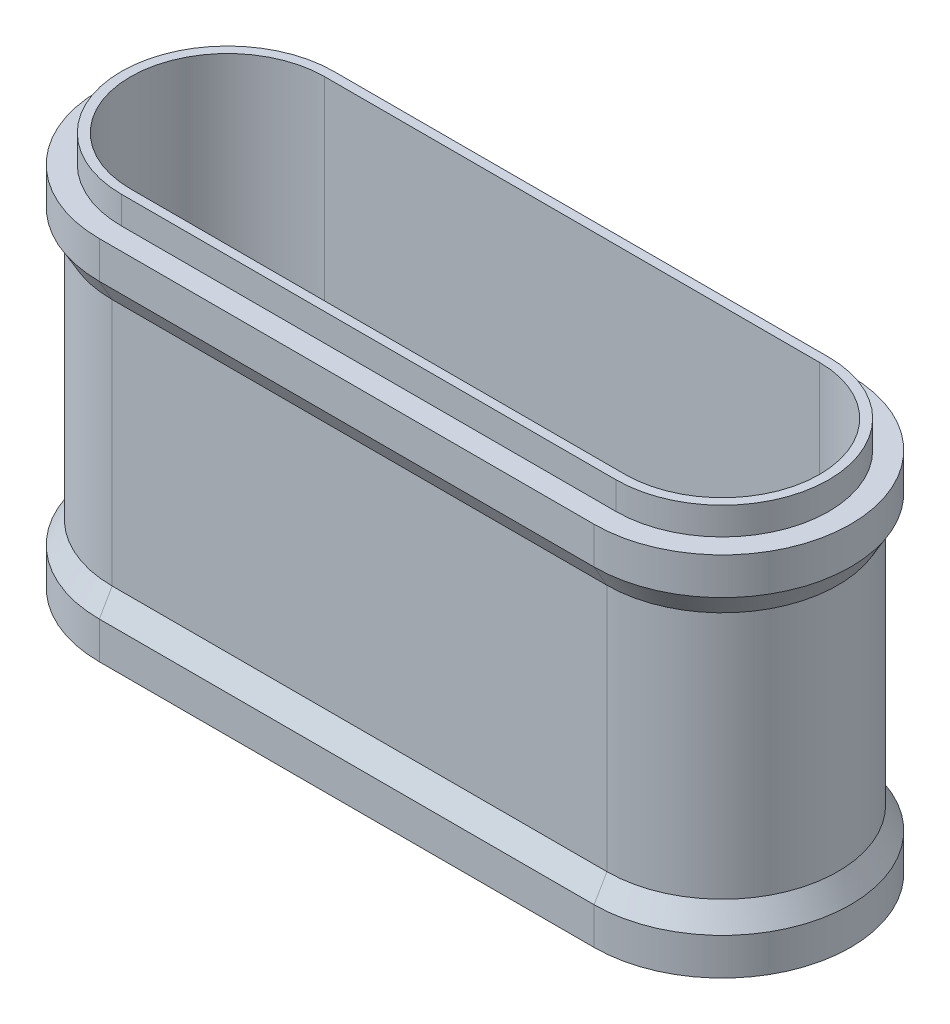
ISO-10303-21;
HEADER;
FILE_DESCRIPTION(('STEP AP214'),'2;1');
FILE_NAME('part.step','',(''),(''),'','','');
FILE_SCHEMA(('AUTOMOTIVE_DESIGN { 1 0 10303 214 1 1 1 1 }'));
ENDSEC;
DATA;
#1=APPLICATION_CONTEXT('core data for automotive mechanical design processes');
#2=APPLICATION_PROTOCOL_DEFINITION('international standard','automotive_design',2000,#1);
#3=PRODUCT_CONTEXT('',#1,'mechanical');
#4=PRODUCT('Part','Part','',(#3));
#5=PRODUCT_RELATED_PRODUCT_CATEGORY('part','',(#4));
#6=PRODUCT_DEFINITION_FORMATION('','',#4);
#7=PRODUCT_DEFINITION_CONTEXT('part definition',#1,'design');
#8=PRODUCT_DEFINITION('design','',#6,#7);
#9=PRODUCT_DEFINITION_SHAPE('','',#8);
#10=(LENGTH_UNIT() NAMED_UNIT(*) SI_UNIT(.MILLI.,.METRE.));
#11=(NAMED_UNIT(*) PLANE_ANGLE_UNIT() SI_UNIT($,.RADIAN.));
#12=(NAMED_UNIT(*) SI_UNIT($,.STERADIAN.) SOLID_ANGLE_UNIT());
#13=UNCERTAINTY_MEASURE_WITH_UNIT(LENGTH_MEASURE(1.E-05),#10,'distance_accuracy_value','');
#14=(GEOMETRIC_REPRESENTATION_CONTEXT(3) GLOBAL_UNCERTAINTY_ASSIGNED_CONTEXT((#13)) GLOBAL_UNIT_ASSIGNED_CONTEXT((#10,
#11,#12)) REPRESENTATION_CONTEXT('',''));
#15=CARTESIAN_POINT('',(0.,0.,0.));
#16=DIRECTION('',(0.,0.,1.));
#17=DIRECTION('',(1.,0.,0.));
#18=AXIS2_PLACEMENT_3D('',#15,#16,#17);
#19=CARTESIAN_POINT('',(-13.5,10.,0.));
#20=DIRECTION('',(0.,1.,0.));
#21=DIRECTION('',(0.,0.,1.));
#22=AXIS2_PLACEMENT_3D('',#19,#20,#21);
#23=PLANE('',#22);
#24=CARTESIAN_POINT('',(13.5,10.,0.));
#25=DIRECTION('',(0.,1.,0.));
#26=DIRECTION('',(0.,0.,1.));
#27=AXIS2_PLACEMENT_3D('',#24,#25,#26);
#28=CIRCLE('',#27,7.);
#29=CARTESIAN_POINT('',(13.5,10.,6.99999999999999));
#30=VERTEX_POINT('',#29);
#31=CARTESIAN_POINT('',(13.5,10.,-7.00000000000001));
#32=VERTEX_POINT('',#31);
#33=EDGE_CURVE('E293',#30,#32,#28,.T.);
#34=ORIENTED_EDGE('',*,*,#33,.T.);
#35=DIRECTION('',(-1.,0.,0.));
#36=VECTOR('',#35,1.);
#37=CARTESIAN_POINT('',(13.5,10.,-7.00000000000001));
#38=LINE('',#37,#36);
#39=CARTESIAN_POINT('',(-13.5,10.,-7.));
#40=VERTEX_POINT('',#39);
#41=EDGE_CURVE('E307',#32,#40,#38,.T.);
#42=ORIENTED_EDGE('',*,*,#41,.T.);
#43=CARTESIAN_POINT('',(-13.5,10.,0.));
#44=DIRECTION('',(0.,1.,0.));
#45=DIRECTION('',(0.,0.,1.));
#46=AXIS2_PLACEMENT_3D('',#43,#44,#45);
#47=CIRCLE('',#46,7.);
#48=CARTESIAN_POINT('',(-13.5,10.,7.));
#49=VERTEX_POINT('',#48);
#50=EDGE_CURVE('E311',#40,#49,#47,.T.);
#51=ORIENTED_EDGE('',*,*,#50,.T.);
#52=DIRECTION('',(1.,0.,0.));
#53=VECTOR('',#52,1.);
#54=CARTESIAN_POINT('',(13.5,10.,6.99999999999999));
#55=LINE('',#54,#53);
#56=EDGE_CURVE('E315',#49,#30,#55,.T.);
#57=ORIENTED_EDGE('',*,*,#56,.T.);
#58=EDGE_LOOP('',(#34,#42,#51,#57));
#59=FACE_BOUND('',#58,.T.);
#60=DIRECTION('',(1.,0.,0.));
#61=VECTOR('',#60,1.);
#62=CARTESIAN_POINT('',(-13.5,10.,5.8));
#63=LINE('',#62,#61);
#64=CARTESIAN_POINT('',(-13.5,10.,5.8));
#65=VERTEX_POINT('',#64);
#66=CARTESIAN_POINT('',(13.5,10.,5.8));
#67=VERTEX_POINT('',#66);
#68=EDGE_CURVE('E253',#65,#67,#63,.T.);
#69=ORIENTED_EDGE('',*,*,#68,.F.);
#70=CARTESIAN_POINT('',(-13.5,10.,0.));
#71=DIRECTION('',(0.,1.,0.));
#72=DIRECTION('',(0.,0.,1.));
#73=AXIS2_PLACEMENT_3D('',#70,#71,#72);
#74=CIRCLE('',#73,5.8);
#75=CARTESIAN_POINT('',(-13.5,10.,-5.8));
#76=VERTEX_POINT('',#75);
#77=EDGE_CURVE('E234',#76,#65,#74,.T.);
#78=ORIENTED_EDGE('',*,*,#77,.F.);
#79=DIRECTION('',(-1.,0.,0.));
#80=VECTOR('',#79,1.);
#81=CARTESIAN_POINT('',(13.5,10.,-5.8));
#82=LINE('',#81,#80);
#83=CARTESIAN_POINT('',(13.5,10.,-5.8));
#84=VERTEX_POINT('',#83);
#85=EDGE_CURVE('E240',#84,#76,#82,.T.);
#86=ORIENTED_EDGE('',*,*,#85,.F.);
#87=CARTESIAN_POINT('',(13.5,10.,0.));
#88=DIRECTION('',(0.,1.,0.));
#89=DIRECTION('',(0.,0.,1.));
#90=AXIS2_PLACEMENT_3D('',#87,#88,#89);
#91=CIRCLE('',#90,5.8);
#92=EDGE_CURVE('E256',#67,#84,#91,.T.);
#93=ORIENTED_EDGE('',*,*,#92,.F.);
#94=EDGE_LOOP('',(#69,#78,#86,#93));
#95=FACE_BOUND('',#94,.T.);
#96=ADVANCED_FACE('F55',(#59,#95),#23,.T.);
#97=CARTESIAN_POINT('',(-13.5,-10.,0.));
#98=DIRECTION('',(0.,1.,0.));
#99=DIRECTION('',(0.,0.,1.));
#100=AXIS2_PLACEMENT_3D('',#97,#98,#99);
#101=CYLINDRICAL_SURFACE('',#100,6.3);
#102=DIRECTION('',(0.,1.,0.));
#103=VECTOR('',#102,1.);
#104=CARTESIAN_POINT('',(-13.5,-10.,-6.3));
#105=LINE('',#104,#103);
#106=CARTESIAN_POINT('',(-13.5,-6.76794919243109,-6.3));
#107=VERTEX_POINT('',#106);
#108=CARTESIAN_POINT('',(-13.5,6.76794919243109,-6.3));
#109=VERTEX_POINT('',#108);
#110=EDGE_CURVE('E350',#107,#109,#105,.T.);
#111=ORIENTED_EDGE('',*,*,#110,.F.);
#112=CARTESIAN_POINT('',(-13.5,-6.76794919243109,0.));
#113=DIRECTION('',(0.,-1.,0.));
#114=DIRECTION('',(0.,0.,-1.));
#115=AXIS2_PLACEMENT_3D('',#112,#113,#114);
#116=CIRCLE('',#115,6.3);
#117=CARTESIAN_POINT('',(-13.5,-6.76794919243109,6.3));
#118=VERTEX_POINT('',#117);
#119=EDGE_CURVE('E387',#107,#118,#116,.F.);
#120=ORIENTED_EDGE('',*,*,#119,.T.);
#121=DIRECTION('',(0.,1.,0.));
#122=VECTOR('',#121,1.);
#123=CARTESIAN_POINT('',(-13.5,-10.,6.3));
#124=LINE('',#123,#122);
#125=CARTESIAN_POINT('',(-13.5,6.76794919243109,6.3));
#126=VERTEX_POINT('',#125);
#127=EDGE_CURVE('E344',#118,#126,#124,.T.);
#128=ORIENTED_EDGE('',*,*,#127,.T.);
#129=CARTESIAN_POINT('',(-13.5,6.76794919243109,0.));
#130=DIRECTION('',(0.,1.,0.));
#131=DIRECTION('',(0.,0.,1.));
#132=AXIS2_PLACEMENT_3D('',#129,#130,#131);
#133=CIRCLE('',#132,6.3);
#134=EDGE_CURVE('E384',#126,#109,#133,.F.);
#135=ORIENTED_EDGE('',*,*,#134,.T.);
#136=EDGE_LOOP('',(#111,#120,#128,#135));
#137=FACE_BOUND('',#136,.T.);
#138=ADVANCED_FACE('F490',(#137),#101,.T.);
#139=CARTESIAN_POINT('',(-13.5,-10.,-6.3));
#140=DIRECTION('',(0.,0.,-1.));
#141=DIRECTION('',(-1.,0.,0.));
#142=AXIS2_PLACEMENT_3D('',#139,#140,#141);
#143=PLANE('',#142);
#144=DIRECTION('',(0.,1.,0.));
#145=VECTOR('',#144,1.);
#146=CARTESIAN_POINT('',(13.5,-10.,-6.3));
#147=LINE('',#146,#145);
#148=CARTESIAN_POINT('',(13.5,-6.76794919243109,-6.3));
#149=VERTEX_POINT('',#148);
#150=CARTESIAN_POINT('',(13.5,6.76794919243109,-6.3));
#151=VERTEX_POINT('',#150);
#152=EDGE_CURVE('E355',#149,#151,#147,.T.);
#153=ORIENTED_EDGE('',*,*,#152,.F.);
#154=DIRECTION('',(-1.,0.,0.));
#155=VECTOR('',#154,1.);
#156=CARTESIAN_POINT('',(-13.5,-6.76794919243109,-6.3));
#157=LINE('',#156,#155);
#158=EDGE_CURVE('E376',#149,#107,#157,.T.);
#159=ORIENTED_EDGE('',*,*,#158,.T.);
#160=ORIENTED_EDGE('',*,*,#110,.T.);
#161=DIRECTION('',(1.,0.,0.));
#162=VECTOR('',#161,1.);
#163=CARTESIAN_POINT('',(-13.5,6.76794919243109,-6.3));
#164=LINE('',#163,#162);
#165=EDGE_CURVE('E372',#109,#151,#164,.T.);
#166=ORIENTED_EDGE('',*,*,#165,.T.);
#167=EDGE_LOOP('',(#153,#159,#160,#166));
#168=FACE_BOUND('',#167,.T.);
#169=ADVANCED_FACE('F471',(#168),#143,.T.);
#170=CARTESIAN_POINT('',(13.5,-10.,0.));
#171=DIRECTION('',(0.,1.,0.));
#172=DIRECTION('',(0.,0.,1.));
#173=AXIS2_PLACEMENT_3D('',#170,#171,#172);
#174=CYLINDRICAL_SURFACE('',#173,6.3);
#175=DIRECTION('',(0.,1.,0.));
#176=VECTOR('',#175,1.);
#177=CARTESIAN_POINT('',(13.5,-10.,6.3));
#178=LINE('',#177,#176);
#179=CARTESIAN_POINT('',(13.5,-6.76794919243109,6.3));
#180=VERTEX_POINT('',#179);
#181=CARTESIAN_POINT('',(13.5,6.76794919243109,6.3));
#182=VERTEX_POINT('',#181);
#183=EDGE_CURVE('E359',#180,#182,#178,.T.);
#184=ORIENTED_EDGE('',*,*,#183,.F.);
#185=CARTESIAN_POINT('',(13.5,-6.76794919243109,0.));
#186=DIRECTION('',(0.,-1.,0.));
#187=DIRECTION('',(0.,0.,-1.));
#188=AXIS2_PLACEMENT_3D('',#185,#186,#187);
#189=CIRCLE('',#188,6.3);
#190=EDGE_CURVE('E368',#180,#149,#189,.F.);
#191=ORIENTED_EDGE('',*,*,#190,.T.);
#192=ORIENTED_EDGE('',*,*,#152,.T.);
#193=CARTESIAN_POINT('',(13.5,6.76794919243109,0.));
#194=DIRECTION('',(0.,1.,0.));
#195=DIRECTION('',(0.,0.,1.));
#196=AXIS2_PLACEMENT_3D('',#193,#194,#195);
#197=CIRCLE('',#196,6.3);
#198=EDGE_CURVE('E354',#151,#182,#197,.F.);
#199=ORIENTED_EDGE('',*,*,#198,.T.);
#200=EDGE_LOOP('',(#184,#191,#192,#199));
#201=FACE_BOUND('',#200,.T.);
#202=ADVANCED_FACE('F475',(#201),#174,.T.);
#203=CARTESIAN_POINT('',(-13.5,-10.,6.3));
#204=DIRECTION('',(0.,0.,1.));
#205=DIRECTION('',(1.,0.,0.));
#206=AXIS2_PLACEMENT_3D('',#203,#204,#205);
#207=PLANE('',#206);
#208=ORIENTED_EDGE('',*,*,#127,.F.);
#209=DIRECTION('',(1.,0.,0.));
#210=VECTOR('',#209,1.);
#211=CARTESIAN_POINT('',(-13.5,-6.76794919243109,6.3));
#212=LINE('',#211,#210);
#213=EDGE_CURVE('E381',#118,#180,#212,.T.);
#214=ORIENTED_EDGE('',*,*,#213,.T.);
#215=ORIENTED_EDGE('',*,*,#183,.T.);
#216=DIRECTION('',(-1.,0.,0.));
#217=VECTOR('',#216,1.);
#218=CARTESIAN_POINT('',(-13.5,6.76794919243109,6.3));
#219=LINE('',#218,#217);
#220=EDGE_CURVE('E378',#182,#126,#219,.T.);
#221=ORIENTED_EDGE('',*,*,#220,.T.);
#222=EDGE_LOOP('',(#208,#214,#215,#221));
#223=FACE_BOUND('',#222,.T.);
#224=ADVANCED_FACE('F500',(#223),#207,.T.);
#225=CARTESIAN_POINT('',(-13.5,-10.,0.));
#226=DIRECTION('',(0.,1.,0.));
#227=DIRECTION('',(0.,0.,1.));
#228=AXIS2_PLACEMENT_3D('',#225,#226,#227);
#229=PLANE('',#228);
#230=DIRECTION('',(-1.,0.,0.));
#231=VECTOR('',#230,1.);
#232=CARTESIAN_POINT('',(-13.5,-10.,-5.3));
#233=LINE('',#232,#231);
#234=CARTESIAN_POINT('',(13.5,-10.,-5.30000000000001));
#235=VERTEX_POINT('',#234);
#236=CARTESIAN_POINT('',(-13.5,-10.,-5.3));
#237=VERTEX_POINT('',#236);
#238=EDGE_CURVE('E203',#235,#237,#233,.T.);
#239=ORIENTED_EDGE('',*,*,#238,.T.);
#240=CARTESIAN_POINT('',(-13.5,-10.,0.));
#241=DIRECTION('',(0.,1.,0.));
#242=DIRECTION('',(0.,0.,1.));
#243=AXIS2_PLACEMENT_3D('',#240,#241,#242);
#244=CIRCLE('',#243,5.3);
#245=CARTESIAN_POINT('',(-13.5,-10.,5.3));
#246=VERTEX_POINT('',#245);
#247=EDGE_CURVE('E322',#237,#246,#244,.T.);
#248=ORIENTED_EDGE('',*,*,#247,.T.);
#249=DIRECTION('',(1.,0.,0.));
#250=VECTOR('',#249,1.);
#251=CARTESIAN_POINT('',(-13.5,-10.,5.3));
#252=LINE('',#251,#250);
#253=CARTESIAN_POINT('',(13.5,-10.,5.29999999999999));
#254=VERTEX_POINT('',#253);
#255=EDGE_CURVE('E333',#246,#254,#252,.T.);
#256=ORIENTED_EDGE('',*,*,#255,.T.);
#257=CARTESIAN_POINT('',(13.5,-10.,0.));
#258=DIRECTION('',(0.,1.,0.));
#259=DIRECTION('',(0.,0.,1.));
#260=AXIS2_PLACEMENT_3D('',#257,#258,#259);
#261=CIRCLE('',#260,5.3);
#262=EDGE_CURVE('E337',#254,#235,#261,.T.);
#263=ORIENTED_EDGE('',*,*,#262,.T.);
#264=EDGE_LOOP('',(#239,#248,#256,#263));
#265=FACE_BOUND('',#264,.T.);
#266=CARTESIAN_POINT('',(13.5,-10.,0.));
#267=DIRECTION('',(0.,1.,0.));
#268=DIRECTION('',(0.,0.,1.));
#269=AXIS2_PLACEMENT_3D('',#266,#267,#268);
#270=CIRCLE('',#269,7.);
#271=CARTESIAN_POINT('',(13.5,-10.,6.99999999999999));
#272=VERTEX_POINT('',#271);
#273=CARTESIAN_POINT('',(13.5,-10.,-7.00000000000001));
#274=VERTEX_POINT('',#273);
#275=EDGE_CURVE('E275',#272,#274,#270,.T.);
#276=ORIENTED_EDGE('',*,*,#275,.F.);
#277=DIRECTION('',(1.,0.,0.));
#278=VECTOR('',#277,1.);
#279=CARTESIAN_POINT('',(13.5,-10.,6.99999999999999));
#280=LINE('',#279,#278);
#281=CARTESIAN_POINT('',(-13.5,-10.,7.));
#282=VERTEX_POINT('',#281);
#283=EDGE_CURVE('E279',#282,#272,#280,.T.);
#284=ORIENTED_EDGE('',*,*,#283,.F.);
#285=CARTESIAN_POINT('',(-13.5,-10.,0.));
#286=DIRECTION('',(0.,1.,0.));
#287=DIRECTION('',(0.,0.,1.));
#288=AXIS2_PLACEMENT_3D('',#285,#286,#287);
#289=CIRCLE('',#288,7.);
#290=CARTESIAN_POINT('',(-13.5,-10.,-7.));
#291=VERTEX_POINT('',#290);
#292=EDGE_CURVE('E282',#291,#282,#289,.T.);
#293=ORIENTED_EDGE('',*,*,#292,.F.);
#294=DIRECTION('',(-1.,0.,0.));
#295=VECTOR('',#294,1.);
#296=CARTESIAN_POINT('',(13.5,-10.,-7.00000000000001));
#297=LINE('',#296,#295);
#298=EDGE_CURVE('E285',#274,#291,#297,.T.);
#299=ORIENTED_EDGE('',*,*,#298,.F.);
#300=EDGE_LOOP('',(#276,#284,#293,#299));
#301=FACE_BOUND('',#300,.T.);
#302=ADVANCED_FACE('F502',(#265,#301),#229,.F.);
#303=CARTESIAN_POINT('',(-13.5,-10.,0.));
#304=DIRECTION('',(0.,1.,0.));
#305=DIRECTION('',(0.,0.,1.));
#306=AXIS2_PLACEMENT_3D('',#303,#304,#305);
#307=CYLINDRICAL_SURFACE('',#306,5.3);
#308=DIRECTION('',(0.,1.,0.));
#309=VECTOR('',#308,1.);
#310=CARTESIAN_POINT('',(-13.5,-10.,-5.3));
#311=LINE('',#310,#309);
#312=CARTESIAN_POINT('',(-13.5,11.5,-5.3));
#313=VERTEX_POINT('',#312);
#314=EDGE_CURVE('E207',#237,#313,#311,.T.);
#315=ORIENTED_EDGE('',*,*,#314,.T.);
#316=CARTESIAN_POINT('',(-13.5,11.5,0.));
#317=DIRECTION('',(0.,1.,0.));
#318=DIRECTION('',(0.,0.,1.));
#319=AXIS2_PLACEMENT_3D('',#316,#317,#318);
#320=CIRCLE('',#319,5.3);
#321=CARTESIAN_POINT('',(-13.5,11.5,5.3));
#322=VERTEX_POINT('',#321);
#323=EDGE_CURVE('E222',#313,#322,#320,.T.);
#324=ORIENTED_EDGE('',*,*,#323,.T.);
#325=DIRECTION('',(0.,1.,0.));
#326=VECTOR('',#325,1.);
#327=CARTESIAN_POINT('',(-13.5,-10.,5.3));
#328=LINE('',#327,#326);
#329=EDGE_CURVE('E342',#246,#322,#328,.T.);
#330=ORIENTED_EDGE('',*,*,#329,.F.);
#331=ORIENTED_EDGE('',*,*,#247,.F.);
#332=EDGE_LOOP('',(#315,#324,#330,#331));
#333=FACE_BOUND('',#332,.T.);
#334=ADVANCED_FACE('F507',(#333),#307,.F.);
#335=CARTESIAN_POINT('',(-13.5,-10.,-5.3));
#336=DIRECTION('',(0.,0.,-1.));
#337=DIRECTION('',(-1.,0.,0.));
#338=AXIS2_PLACEMENT_3D('',#335,#336,#337);
#339=PLANE('',#338);
#340=DIRECTION('',(0.,1.,0.));
#341=VECTOR('',#340,1.);
#342=CARTESIAN_POINT('',(13.5,-10.,-5.30000000000001));
#343=LINE('',#342,#341);
#344=CARTESIAN_POINT('',(13.5,11.5,-5.30000000000001));
#345=VERTEX_POINT('',#344);
#346=EDGE_CURVE('E196',#235,#345,#343,.T.);
#347=ORIENTED_EDGE('',*,*,#346,.T.);
#348=DIRECTION('',(-1.,0.,0.));
#349=VECTOR('',#348,1.);
#350=CARTESIAN_POINT('',(13.5,11.5,-5.30000000000001));
#351=LINE('',#350,#349);
#352=EDGE_CURVE('E200',#345,#313,#351,.T.);
#353=ORIENTED_EDGE('',*,*,#352,.T.);
#354=ORIENTED_EDGE('',*,*,#314,.F.);
#355=ORIENTED_EDGE('',*,*,#238,.F.);
#356=EDGE_LOOP('',(#347,#353,#354,#355));
#357=FACE_BOUND('',#356,.T.);
#358=ADVANCED_FACE('F198',(#357),#339,.F.);
#359=CARTESIAN_POINT('',(13.5,-10.,0.));
#360=DIRECTION('',(0.,1.,0.));
#361=DIRECTION('',(0.,0.,1.));
#362=AXIS2_PLACEMENT_3D('',#359,#360,#361);
#363=CYLINDRICAL_SURFACE('',#362,5.3);
#364=DIRECTION('',(0.,1.,0.));
#365=VECTOR('',#364,1.);
#366=CARTESIAN_POINT('',(13.5,-10.,5.3));
#367=LINE('',#366,#365);
#368=CARTESIAN_POINT('',(13.5,11.5,5.3));
#369=VERTEX_POINT('',#368);
#370=EDGE_CURVE('E208',#254,#369,#367,.T.);
#371=ORIENTED_EDGE('',*,*,#370,.T.);
#372=CARTESIAN_POINT('',(13.5,11.5,0.));
#373=DIRECTION('',(0.,1.,0.));
#374=DIRECTION('',(0.,0.,1.));
#375=AXIS2_PLACEMENT_3D('',#372,#373,#374);
#376=CIRCLE('',#375,5.3);
#377=EDGE_CURVE('E211',#369,#345,#376,.T.);
#378=ORIENTED_EDGE('',*,*,#377,.T.);
#379=ORIENTED_EDGE('',*,*,#346,.F.);
#380=ORIENTED_EDGE('',*,*,#262,.F.);
#381=EDGE_LOOP('',(#371,#378,#379,#380));
#382=FACE_BOUND('',#381,.T.);
#383=ADVANCED_FACE('F212',(#382),#363,.F.);
#384=CARTESIAN_POINT('',(-13.5,-10.,5.3));
#385=DIRECTION('',(0.,0.,1.));
#386=DIRECTION('',(1.,0.,0.));
#387=AXIS2_PLACEMENT_3D('',#384,#385,#386);
#388=PLANE('',#387);
#389=ORIENTED_EDGE('',*,*,#329,.T.);
#390=DIRECTION('',(1.,0.,0.));
#391=VECTOR('',#390,1.);
#392=CARTESIAN_POINT('',(-13.5,11.5,5.3));
#393=LINE('',#392,#391);
#394=EDGE_CURVE('E229',#322,#369,#393,.T.);
#395=ORIENTED_EDGE('',*,*,#394,.T.);
#396=ORIENTED_EDGE('',*,*,#370,.F.);
#397=ORIENTED_EDGE('',*,*,#255,.F.);
#398=EDGE_LOOP('',(#389,#395,#396,#397));
#399=FACE_BOUND('',#398,.T.);
#400=ADVANCED_FACE('F523',(#399),#388,.F.);
#401=CARTESIAN_POINT('',(13.5,8.5,0.));
#402=DIRECTION('',(0.,1.,0.));
#403=DIRECTION('',(0.,0.,1.));
#404=AXIS2_PLACEMENT_3D('',#401,#402,#403);
#405=CYLINDRICAL_SURFACE('',#404,7.);
#406=ORIENTED_EDGE('',*,*,#33,.F.);
#407=DIRECTION('',(0.,1.,0.));
#408=VECTOR('',#407,1.);
#409=CARTESIAN_POINT('',(13.5,8.5,6.99999999999999));
#410=LINE('',#409,#408);
#411=CARTESIAN_POINT('',(13.5,7.98038475772932,7.));
#412=VERTEX_POINT('',#411);
#413=EDGE_CURVE('E74',#412,#30,#410,.T.);
#414=ORIENTED_EDGE('',*,*,#413,.F.);
#415=CARTESIAN_POINT('',(13.5,7.98038475772932,0.));
#416=DIRECTION('',(0.,1.,0.));
#417=DIRECTION('',(0.,0.,1.));
#418=AXIS2_PLACEMENT_3D('',#415,#416,#417);
#419=CIRCLE('',#418,7.);
#420=CARTESIAN_POINT('',(13.5,7.98038475772933,-7.00000000000001));
#421=VERTEX_POINT('',#420);
#422=EDGE_CURVE('E410',#412,#421,#419,.T.);
#423=ORIENTED_EDGE('',*,*,#422,.T.);
#424=DIRECTION('',(0.,1.,0.));
#425=VECTOR('',#424,1.);
#426=CARTESIAN_POINT('',(13.5,8.5,-7.00000000000001));
#427=LINE('',#426,#425);
#428=EDGE_CURVE('E319',#421,#32,#427,.T.);
#429=ORIENTED_EDGE('',*,*,#428,.T.);
#430=EDGE_LOOP('',(#406,#414,#423,#429));
#431=FACE_BOUND('',#430,.T.);
#432=ADVANCED_FACE('F456',(#431),#405,.T.);
#433=CARTESIAN_POINT('',(13.5,8.5,6.99999999999999));
#434=DIRECTION('',(0.,0.,1.));
#435=DIRECTION('',(1.,0.,0.));
#436=AXIS2_PLACEMENT_3D('',#433,#434,#435);
#437=PLANE('',#436);
#438=ORIENTED_EDGE('',*,*,#56,.F.);
#439=DIRECTION('',(0.,1.,0.));
#440=VECTOR('',#439,1.);
#441=CARTESIAN_POINT('',(-13.5,8.5,7.));
#442=LINE('',#441,#440);
#443=CARTESIAN_POINT('',(-13.5,7.98038475772932,7.));
#444=VERTEX_POINT('',#443);
#445=EDGE_CURVE('E80',#444,#49,#442,.T.);
#446=ORIENTED_EDGE('',*,*,#445,.F.);
#447=DIRECTION('',(1.,0.,0.));
#448=VECTOR('',#447,1.);
#449=CARTESIAN_POINT('',(-13.5,7.98038475772932,7.));
#450=LINE('',#449,#448);
#451=EDGE_CURVE('E11',#444,#412,#450,.T.);
#452=ORIENTED_EDGE('',*,*,#451,.T.);
#453=ORIENTED_EDGE('',*,*,#413,.T.);
#454=EDGE_LOOP('',(#438,#446,#452,#453));
#455=FACE_BOUND('',#454,.T.);
#456=ADVANCED_FACE('F455',(#455),#437,.T.);
#457=CARTESIAN_POINT('',(-13.5,8.5,0.));
#458=DIRECTION('',(0.,1.,0.));
#459=DIRECTION('',(0.,0.,1.));
#460=AXIS2_PLACEMENT_3D('',#457,#458,#459);
#461=CYLINDRICAL_SURFACE('',#460,7.);
#462=ORIENTED_EDGE('',*,*,#50,.F.);
#463=DIRECTION('',(0.,1.,0.));
#464=VECTOR('',#463,1.);
#465=CARTESIAN_POINT('',(-13.5,8.5,-7.));
#466=LINE('',#465,#464);
#467=CARTESIAN_POINT('',(-13.5,7.98038475772931,-7.));
#468=VERTEX_POINT('',#467);
#469=EDGE_CURVE('E325',#468,#40,#466,.T.);
#470=ORIENTED_EDGE('',*,*,#469,.F.);
#471=CARTESIAN_POINT('',(-13.5,7.98038475772931,0.));
#472=DIRECTION('',(0.,1.,0.));
#473=DIRECTION('',(0.,0.,1.));
#474=AXIS2_PLACEMENT_3D('',#471,#472,#473);
#475=CIRCLE('',#474,7.);
#476=EDGE_CURVE('E66',#468,#444,#475,.T.);
#477=ORIENTED_EDGE('',*,*,#476,.T.);
#478=ORIENTED_EDGE('',*,*,#445,.T.);
#479=EDGE_LOOP('',(#462,#470,#477,#478));
#480=FACE_BOUND('',#479,.T.);
#481=ADVANCED_FACE('F462',(#480),#461,.T.);
#482=CARTESIAN_POINT('',(13.5,8.5,-7.00000000000001));
#483=DIRECTION('',(0.,0.,-1.));
#484=DIRECTION('',(-1.,0.,0.));
#485=AXIS2_PLACEMENT_3D('',#482,#483,#484);
#486=PLANE('',#485);
#487=ORIENTED_EDGE('',*,*,#428,.F.);
#488=DIRECTION('',(-1.,0.,0.));
#489=VECTOR('',#488,1.);
#490=CARTESIAN_POINT('',(-13.5,7.98038475772931,-7.));
#491=LINE('',#490,#489);
#492=EDGE_CURVE('E406',#421,#468,#491,.T.);
#493=ORIENTED_EDGE('',*,*,#492,.T.);
#494=ORIENTED_EDGE('',*,*,#469,.T.);
#495=ORIENTED_EDGE('',*,*,#41,.F.);
#496=EDGE_LOOP('',(#487,#493,#494,#495));
#497=FACE_BOUND('',#496,.T.);
#498=ADVANCED_FACE('F568',(#497),#486,.T.);
#499=CARTESIAN_POINT('',(13.5,-8.5,0.));
#500=DIRECTION('',(0.,-1.,0.));
#501=DIRECTION('',(0.,0.,-1.));
#502=AXIS2_PLACEMENT_3D('',#499,#500,#501);
#503=CYLINDRICAL_SURFACE('',#502,7.);
#504=ORIENTED_EDGE('',*,*,#275,.T.);
#505=DIRECTION('',(0.,-1.,0.));
#506=VECTOR('',#505,1.);
#507=CARTESIAN_POINT('',(13.5,-8.5,-7.00000000000001));
#508=LINE('',#507,#506);
#509=CARTESIAN_POINT('',(13.5,-7.98038475772931,-7.));
#510=VERTEX_POINT('',#509);
#511=EDGE_CURVE('E289',#510,#274,#508,.T.);
#512=ORIENTED_EDGE('',*,*,#511,.F.);
#513=CARTESIAN_POINT('',(13.5,-7.98038475772931,0.));
#514=DIRECTION('',(0.,-1.,0.));
#515=DIRECTION('',(0.,0.,-1.));
#516=AXIS2_PLACEMENT_3D('',#513,#514,#515);
#517=CIRCLE('',#516,7.);
#518=CARTESIAN_POINT('',(13.5,-7.98038475772931,6.99999999999999));
#519=VERTEX_POINT('',#518);
#520=EDGE_CURVE('E390',#510,#519,#517,.T.);
#521=ORIENTED_EDGE('',*,*,#520,.T.);
#522=DIRECTION('',(0.,-1.,0.));
#523=VECTOR('',#522,1.);
#524=CARTESIAN_POINT('',(13.5,-8.5,6.99999999999999));
#525=LINE('',#524,#523);
#526=EDGE_CURVE('E288',#519,#272,#525,.T.);
#527=ORIENTED_EDGE('',*,*,#526,.T.);
#528=EDGE_LOOP('',(#504,#512,#521,#527));
#529=FACE_BOUND('',#528,.T.);
#530=ADVANCED_FACE('F576',(#529),#503,.T.);
#531=CARTESIAN_POINT('',(13.5,-8.5,-7.00000000000001));
#532=DIRECTION('',(0.,0.,1.));
#533=DIRECTION('',(1.,0.,0.));
#534=AXIS2_PLACEMENT_3D('',#531,#532,#533);
#535=PLANE('',#534);
#536=ORIENTED_EDGE('',*,*,#298,.T.);
#537=DIRECTION('',(0.,-1.,0.));
#538=VECTOR('',#537,1.);
#539=CARTESIAN_POINT('',(-13.5,-8.5,-7.));
#540=LINE('',#539,#538);
#541=CARTESIAN_POINT('',(-13.5,-7.98038475772931,-7.));
#542=VERTEX_POINT('',#541);
#543=EDGE_CURVE('E294',#542,#291,#540,.T.);
#544=ORIENTED_EDGE('',*,*,#543,.F.);
#545=DIRECTION('',(1.,0.,0.));
#546=VECTOR('',#545,1.);
#547=CARTESIAN_POINT('',(13.5,-7.98038475772932,-7.00000000000001));
#548=LINE('',#547,#546);
#549=EDGE_CURVE('E394',#542,#510,#548,.T.);
#550=ORIENTED_EDGE('',*,*,#549,.T.);
#551=ORIENTED_EDGE('',*,*,#511,.T.);
#552=EDGE_LOOP('',(#536,#544,#550,#551));
#553=FACE_BOUND('',#552,.T.);
#554=ADVANCED_FACE('F584',(#553),#535,.F.);
#555=CARTESIAN_POINT('',(-13.5,-8.5,0.));
#556=DIRECTION('',(0.,-1.,0.));
#557=DIRECTION('',(0.,0.,-1.));
#558=AXIS2_PLACEMENT_3D('',#555,#556,#557);
#559=CYLINDRICAL_SURFACE('',#558,7.);
#560=ORIENTED_EDGE('',*,*,#292,.T.);
#561=DIRECTION('',(0.,-1.,0.));
#562=VECTOR('',#561,1.);
#563=CARTESIAN_POINT('',(-13.5,-8.5,7.));
#564=LINE('',#563,#562);
#565=CARTESIAN_POINT('',(-13.5,-7.98038475772931,7.));
#566=VERTEX_POINT('',#565);
#567=EDGE_CURVE('E297',#566,#282,#564,.T.);
#568=ORIENTED_EDGE('',*,*,#567,.F.);
#569=CARTESIAN_POINT('',(-13.5,-7.98038475772931,0.));
#570=DIRECTION('',(0.,-1.,0.));
#571=DIRECTION('',(0.,0.,-1.));
#572=AXIS2_PLACEMENT_3D('',#569,#570,#571);
#573=CIRCLE('',#572,7.);
#574=EDGE_CURVE('E402',#566,#542,#573,.T.);
#575=ORIENTED_EDGE('',*,*,#574,.T.);
#576=ORIENTED_EDGE('',*,*,#543,.T.);
#577=EDGE_LOOP('',(#560,#568,#575,#576));
#578=FACE_BOUND('',#577,.T.);
#579=ADVANCED_FACE('F595',(#578),#559,.T.);
#580=CARTESIAN_POINT('',(13.5,-8.5,6.99999999999999));
#581=DIRECTION('',(0.,0.,-1.));
#582=DIRECTION('',(-1.,0.,0.));
#583=AXIS2_PLACEMENT_3D('',#580,#581,#582);
#584=PLANE('',#583);
#585=ORIENTED_EDGE('',*,*,#283,.T.);
#586=ORIENTED_EDGE('',*,*,#526,.F.);
#587=DIRECTION('',(-1.,0.,0.));
#588=VECTOR('',#587,1.);
#589=CARTESIAN_POINT('',(13.5,-7.98038475772931,6.99999999999999));
#590=LINE('',#589,#588);
#591=EDGE_CURVE('E398',#519,#566,#590,.T.);
#592=ORIENTED_EDGE('',*,*,#591,.T.);
#593=ORIENTED_EDGE('',*,*,#567,.T.);
#594=EDGE_LOOP('',(#585,#586,#592,#593));
#595=FACE_BOUND('',#594,.T.);
#596=ADVANCED_FACE('F605',(#595),#584,.F.);
#597=CARTESIAN_POINT('',(-13.5,11.5,0.));
#598=DIRECTION('',(0.,1.,0.));
#599=DIRECTION('',(0.,0.,1.));
#600=AXIS2_PLACEMENT_3D('',#597,#598,#599);
#601=PLANE('',#600);
#602=CARTESIAN_POINT('',(-13.5,11.5,0.));
#603=DIRECTION('',(0.,1.,0.));
#604=DIRECTION('',(0.,0.,1.));
#605=AXIS2_PLACEMENT_3D('',#602,#603,#604);
#606=CIRCLE('',#605,5.8);
#607=CARTESIAN_POINT('',(-13.5,11.5,-5.8));
#608=VERTEX_POINT('',#607);
#609=CARTESIAN_POINT('',(-13.5,11.5,5.8));
#610=VERTEX_POINT('',#609);
#611=EDGE_CURVE('E235',#608,#610,#606,.T.);
#612=ORIENTED_EDGE('',*,*,#611,.T.);
#613=DIRECTION('',(1.,0.,0.));
#614=VECTOR('',#613,1.);
#615=CARTESIAN_POINT('',(-13.5,11.5,5.8));
#616=LINE('',#615,#614);
#617=CARTESIAN_POINT('',(13.5,11.5,5.8));
#618=VERTEX_POINT('',#617);
#619=EDGE_CURVE('E239',#610,#618,#616,.T.);
#620=ORIENTED_EDGE('',*,*,#619,.T.);
#621=CARTESIAN_POINT('',(13.5,11.5,0.));
#622=DIRECTION('',(0.,1.,0.));
#623=DIRECTION('',(0.,0.,1.));
#624=AXIS2_PLACEMENT_3D('',#621,#622,#623);
#625=CIRCLE('',#624,5.8);
#626=CARTESIAN_POINT('',(13.5,11.5,-5.8));
#627=VERTEX_POINT('',#626);
#628=EDGE_CURVE('E243',#618,#627,#625,.T.);
#629=ORIENTED_EDGE('',*,*,#628,.T.);
#630=DIRECTION('',(-1.,0.,0.));
#631=VECTOR('',#630,1.);
#632=CARTESIAN_POINT('',(13.5,11.5,-5.8));
#633=LINE('',#632,#631);
#634=EDGE_CURVE('E246',#627,#608,#633,.T.);
#635=ORIENTED_EDGE('',*,*,#634,.T.);
#636=EDGE_LOOP('',(#612,#620,#629,#635));
#637=FACE_BOUND('',#636,.T.);
#638=ORIENTED_EDGE('',*,*,#352,.F.);
#639=ORIENTED_EDGE('',*,*,#377,.F.);
#640=ORIENTED_EDGE('',*,*,#394,.F.);
#641=ORIENTED_EDGE('',*,*,#323,.F.);
#642=EDGE_LOOP('',(#638,#639,#640,#641));
#643=FACE_BOUND('',#642,.T.);
#644=ADVANCED_FACE('F220',(#637,#643),#601,.T.);
#645=CARTESIAN_POINT('',(-13.5,11.5,0.));
#646=DIRECTION('',(0.,-1.,0.));
#647=DIRECTION('',(0.,0.,-1.));
#648=AXIS2_PLACEMENT_3D('',#645,#646,#647);
#649=CYLINDRICAL_SURFACE('',#648,5.8);
#650=ORIENTED_EDGE('',*,*,#77,.T.);
#651=DIRECTION('',(0.,-1.,0.));
#652=VECTOR('',#651,1.);
#653=CARTESIAN_POINT('',(-13.5,11.5,5.8));
#654=LINE('',#653,#652);
#655=EDGE_CURVE('E272',#610,#65,#654,.T.);
#656=ORIENTED_EDGE('',*,*,#655,.F.);
#657=ORIENTED_EDGE('',*,*,#611,.F.);
#658=DIRECTION('',(0.,-1.,0.));
#659=VECTOR('',#658,1.);
#660=CARTESIAN_POINT('',(-13.5,11.5,-5.8));
#661=LINE('',#660,#659);
#662=EDGE_CURVE('E249',#608,#76,#661,.T.);
#663=ORIENTED_EDGE('',*,*,#662,.T.);
#664=EDGE_LOOP('',(#650,#656,#657,#663));
#665=FACE_BOUND('',#664,.T.);
#666=ADVANCED_FACE('F718',(#665),#649,.T.);
#667=CARTESIAN_POINT('',(-13.5,11.5,5.8));
#668=DIRECTION('',(0.,0.,-1.));
#669=DIRECTION('',(-1.,0.,0.));
#670=AXIS2_PLACEMENT_3D('',#667,#668,#669);
#671=PLANE('',#670);
#672=ORIENTED_EDGE('',*,*,#68,.T.);
#673=DIRECTION('',(0.,-1.,0.));
#674=VECTOR('',#673,1.);
#675=CARTESIAN_POINT('',(13.5,11.5,5.8));
#676=LINE('',#675,#674);
#677=EDGE_CURVE('E268',#618,#67,#676,.T.);
#678=ORIENTED_EDGE('',*,*,#677,.F.);
#679=ORIENTED_EDGE('',*,*,#619,.F.);
#680=ORIENTED_EDGE('',*,*,#655,.T.);
#681=EDGE_LOOP('',(#672,#678,#679,#680));
#682=FACE_BOUND('',#681,.T.);
#683=ADVANCED_FACE('F708',(#682),#671,.F.);
#684=CARTESIAN_POINT('',(13.5,11.5,0.));
#685=DIRECTION('',(0.,-1.,0.));
#686=DIRECTION('',(0.,0.,-1.));
#687=AXIS2_PLACEMENT_3D('',#684,#685,#686);
#688=CYLINDRICAL_SURFACE('',#687,5.8);
#689=ORIENTED_EDGE('',*,*,#92,.T.);
#690=DIRECTION('',(0.,-1.,0.));
#691=VECTOR('',#690,1.);
#692=CARTESIAN_POINT('',(13.5,11.5,-5.8));
#693=LINE('',#692,#691);
#694=EDGE_CURVE('E265',#627,#84,#693,.T.);
#695=ORIENTED_EDGE('',*,*,#694,.F.);
#696=ORIENTED_EDGE('',*,*,#628,.F.);
#697=ORIENTED_EDGE('',*,*,#677,.T.);
#698=EDGE_LOOP('',(#689,#695,#696,#697));
#699=FACE_BOUND('',#698,.T.);
#700=ADVANCED_FACE('F698',(#699),#688,.T.);
#701=CARTESIAN_POINT('',(13.5,11.5,-5.8));
#702=DIRECTION('',(0.,0.,1.));
#703=DIRECTION('',(1.,0.,0.));
#704=AXIS2_PLACEMENT_3D('',#701,#702,#703);
#705=PLANE('',#704);
#706=ORIENTED_EDGE('',*,*,#85,.T.);
#707=ORIENTED_EDGE('',*,*,#662,.F.);
#708=ORIENTED_EDGE('',*,*,#634,.F.);
#709=ORIENTED_EDGE('',*,*,#694,.T.);
#710=EDGE_LOOP('',(#706,#707,#708,#709));
#711=FACE_BOUND('',#710,.T.);
#712=ADVANCED_FACE('F626',(#711),#705,.F.);
#713=CARTESIAN_POINT('',(-13.5,-6.76794919243109,0.));
#714=DIRECTION('',(0.,-1.,0.));
#715=DIRECTION('',(0.,0.,-1.));
#716=AXIS2_PLACEMENT_3D('',#713,#714,#715);
#717=CONICAL_SURFACE('',#716,6.3,0.523598775598295);
#718=DIRECTION('',(0.,0.866025403784441,0.499999999999997));
#719=VECTOR('',#718,1.);
#720=CARTESIAN_POINT('',(-13.5,-8.5,-7.30000000000001));
#721=LINE('',#720,#719);
#722=EDGE_CURVE('E422',#542,#107,#721,.T.);
#723=ORIENTED_EDGE('',*,*,#722,.F.);
#724=ORIENTED_EDGE('',*,*,#574,.F.);
#725=DIRECTION('',(0.,-0.866025403784441,0.499999999999997));
#726=VECTOR('',#725,1.);
#727=CARTESIAN_POINT('',(-13.5,-6.76794919243109,6.3));
#728=LINE('',#727,#726);
#729=EDGE_CURVE('E218',#118,#566,#728,.T.);
#730=ORIENTED_EDGE('',*,*,#729,.F.);
#731=ORIENTED_EDGE('',*,*,#119,.F.);
#732=EDGE_LOOP('',(#723,#724,#730,#731));
#733=FACE_BOUND('',#732,.T.);
#734=ADVANCED_FACE('F494',(#733),#717,.T.);
#735=CARTESIAN_POINT('',(-13.5,-6.76794919243109,6.3));
#736=DIRECTION('',(0.,-0.499999999999996,-0.866025403784441));
#737=DIRECTION('',(1.,0.,0.));
#738=AXIS2_PLACEMENT_3D('',#735,#736,#737);
#739=PLANE('',#738);
#740=ORIENTED_EDGE('',*,*,#729,.T.);
#741=ORIENTED_EDGE('',*,*,#591,.F.);
#742=DIRECTION('',(0.,-0.866025403784441,0.499999999999996));
#743=VECTOR('',#742,1.);
#744=CARTESIAN_POINT('',(13.5,-6.76794919243109,6.29999999999999));
#745=LINE('',#744,#743);
#746=EDGE_CURVE('E418',#180,#519,#745,.T.);
#747=ORIENTED_EDGE('',*,*,#746,.F.);
#748=ORIENTED_EDGE('',*,*,#213,.F.);
#749=EDGE_LOOP('',(#740,#741,#747,#748));
#750=FACE_BOUND('',#749,.T.);
#751=ADVANCED_FACE('F498',(#750),#739,.F.);
#752=CARTESIAN_POINT('',(-13.5,-6.76794919243109,-6.3));
#753=DIRECTION('',(0.,-0.499999999999996,0.866025403784441));
#754=DIRECTION('',(-1.,0.,0.));
#755=AXIS2_PLACEMENT_3D('',#752,#753,#754);
#756=PLANE('',#755);
#757=ORIENTED_EDGE('',*,*,#722,.T.);
#758=ORIENTED_EDGE('',*,*,#158,.F.);
#759=DIRECTION('',(0.,0.866025403784441,0.499999999999996));
#760=VECTOR('',#759,1.);
#761=CARTESIAN_POINT('',(13.5,-8.5,-7.30000000000001));
#762=LINE('',#761,#760);
#763=EDGE_CURVE('E415',#510,#149,#762,.T.);
#764=ORIENTED_EDGE('',*,*,#763,.F.);
#765=ORIENTED_EDGE('',*,*,#549,.F.);
#766=EDGE_LOOP('',(#757,#758,#764,#765));
#767=FACE_BOUND('',#766,.T.);
#768=ADVANCED_FACE('F486',(#767),#756,.F.);
#769=CARTESIAN_POINT('',(13.5,-6.76794919243109,0.));
#770=DIRECTION('',(0.,-1.,0.));
#771=DIRECTION('',(0.,0.,-1.));
#772=AXIS2_PLACEMENT_3D('',#769,#770,#771);
#773=CONICAL_SURFACE('',#772,6.3,0.523598775598295);
#774=ORIENTED_EDGE('',*,*,#746,.T.);
#775=ORIENTED_EDGE('',*,*,#520,.F.);
#776=ORIENTED_EDGE('',*,*,#763,.T.);
#777=ORIENTED_EDGE('',*,*,#190,.F.);
#778=EDGE_LOOP('',(#774,#775,#776,#777));
#779=FACE_BOUND('',#778,.T.);
#780=ADVANCED_FACE('F479',(#779),#773,.T.);
#781=CARTESIAN_POINT('',(-13.5,6.76794919243109,6.3));
#782=DIRECTION('',(0.,0.499999999999996,-0.866025403784441));
#783=DIRECTION('',(-1.,0.,0.));
#784=AXIS2_PLACEMENT_3D('',#781,#782,#783);
#785=PLANE('',#784);
#786=DIRECTION('',(0.,-0.866025403784441,-0.499999999999996));
#787=VECTOR('',#786,1.);
#788=CARTESIAN_POINT('',(13.5,8.5,7.30000000000001));
#789=LINE('',#788,#787);
#790=EDGE_CURVE('E435',#412,#182,#789,.T.);
#791=ORIENTED_EDGE('',*,*,#790,.F.);
#792=ORIENTED_EDGE('',*,*,#451,.F.);
#793=DIRECTION('',(0.,0.866025403784441,0.499999999999996));
#794=VECTOR('',#793,1.);
#795=CARTESIAN_POINT('',(-13.5,6.76794919243109,6.3));
#796=LINE('',#795,#794);
#797=EDGE_CURVE('E60',#126,#444,#796,.T.);
#798=ORIENTED_EDGE('',*,*,#797,.F.);
#799=ORIENTED_EDGE('',*,*,#220,.F.);
#800=EDGE_LOOP('',(#791,#792,#798,#799));
#801=FACE_BOUND('',#800,.T.);
#802=ADVANCED_FACE('F58',(#801),#785,.F.);
#803=CARTESIAN_POINT('',(-13.5,6.76794919243109,0.));
#804=DIRECTION('',(0.,1.,0.));
#805=DIRECTION('',(0.,0.,1.));
#806=AXIS2_PLACEMENT_3D('',#803,#804,#805);
#807=CONICAL_SURFACE('',#806,6.3,0.523598775598295);
#808=ORIENTED_EDGE('',*,*,#797,.T.);
#809=ORIENTED_EDGE('',*,*,#476,.F.);
#810=DIRECTION('',(0.,0.866025403784441,-0.499999999999996));
#811=VECTOR('',#810,1.);
#812=CARTESIAN_POINT('',(-13.5,6.76794919243109,-6.3));
#813=LINE('',#812,#811);
#814=EDGE_CURVE('E432',#109,#468,#813,.T.);
#815=ORIENTED_EDGE('',*,*,#814,.F.);
#816=ORIENTED_EDGE('',*,*,#134,.F.);
#817=EDGE_LOOP('',(#808,#809,#815,#816));
#818=FACE_BOUND('',#817,.T.);
#819=ADVANCED_FACE('F450',(#818),#807,.T.);
#820=CARTESIAN_POINT('',(13.5,6.76794919243109,0.));
#821=DIRECTION('',(0.,1.,0.));
#822=DIRECTION('',(0.,0.,1.));
#823=AXIS2_PLACEMENT_3D('',#820,#821,#822);
#824=CONICAL_SURFACE('',#823,6.3,0.523598775598294);
#825=ORIENTED_EDGE('',*,*,#790,.T.);
#826=ORIENTED_EDGE('',*,*,#198,.F.);
#827=DIRECTION('',(0.,-0.866025403784441,0.499999999999996));
#828=VECTOR('',#827,1.);
#829=CARTESIAN_POINT('',(13.5,8.5,-7.30000000000001));
#830=LINE('',#829,#828);
#831=EDGE_CURVE('E429',#421,#151,#830,.T.);
#832=ORIENTED_EDGE('',*,*,#831,.F.);
#833=ORIENTED_EDGE('',*,*,#422,.F.);
#834=EDGE_LOOP('',(#825,#826,#832,#833));
#835=FACE_BOUND('',#834,.T.);
#836=ADVANCED_FACE('F668',(#835),#824,.T.);
#837=CARTESIAN_POINT('',(-13.5,6.76794919243109,-6.3));
#838=DIRECTION('',(0.,0.499999999999996,0.866025403784441));
#839=DIRECTION('',(1.,0.,0.));
#840=AXIS2_PLACEMENT_3D('',#837,#838,#839);
#841=PLANE('',#840);
#842=ORIENTED_EDGE('',*,*,#165,.F.);
#843=ORIENTED_EDGE('',*,*,#814,.T.);
#844=ORIENTED_EDGE('',*,*,#492,.F.);
#845=ORIENTED_EDGE('',*,*,#831,.T.);
#846=EDGE_LOOP('',(#842,#843,#844,#845));
#847=FACE_BOUND('',#846,.T.);
#848=ADVANCED_FACE('F467',(#847),#841,.F.);
#849=CLOSED_SHELL('',(#96,#138,#169,#202,#224,#302,#334,#358,#383,#400,#432,#456,#481,#498,#530,
#554,#579,#596,#644,#666,#683,#700,#712,#734,#751,#768,#780,#802,#819,#836,#848));
#850=MANIFOLD_SOLID_BREP('B2',#849);
#851=ADVANCED_BREP_SHAPE_REPRESENTATION('',(#18,#850),#14);
#852=SHAPE_DEFINITION_REPRESENTATION(#9,#851);
ENDSEC;
END-ISO-10303-21;
